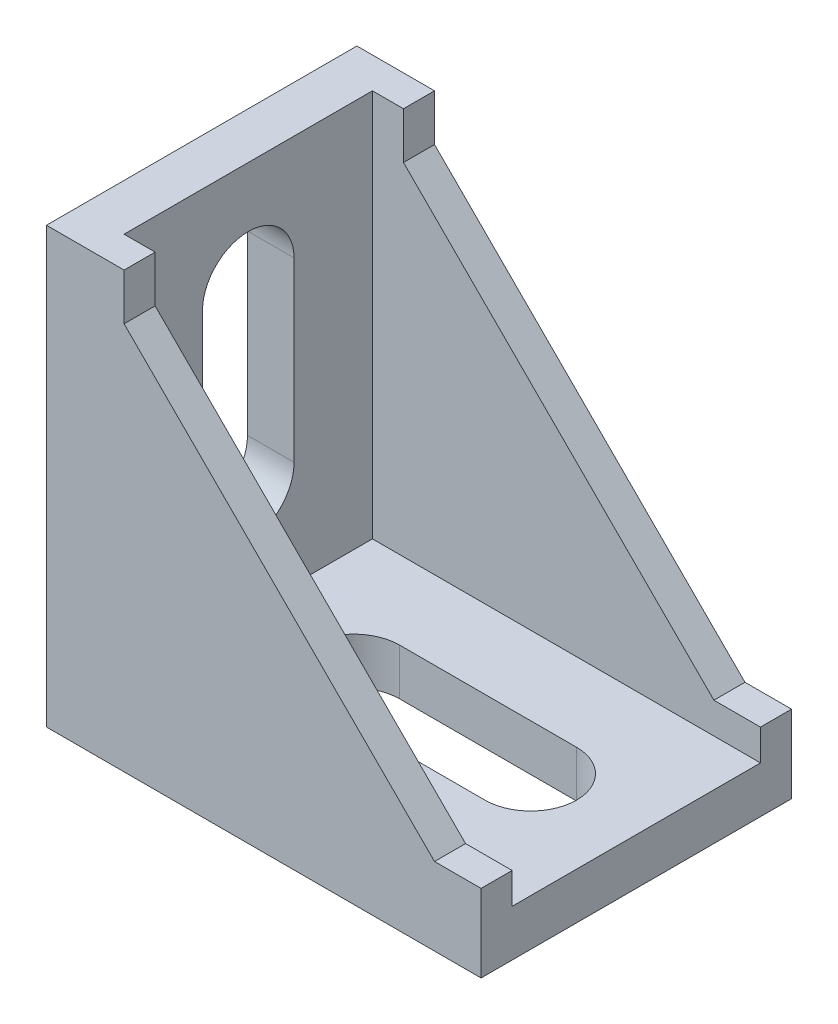
ISO-10303-21;
HEADER;
FILE_DESCRIPTION(('STEP AP214'),'2;1');
FILE_NAME('part.step','',(''),(''),'','','');
FILE_SCHEMA(('AUTOMOTIVE_DESIGN { 1 0 10303 214 1 1 1 1 }'));
ENDSEC;
DATA;
#1=APPLICATION_CONTEXT('core data for automotive mechanical design processes');
#2=APPLICATION_PROTOCOL_DEFINITION('international standard','automotive_design',2000,#1);
#3=PRODUCT_CONTEXT('',#1,'mechanical');
#4=PRODUCT('Part','Part','',(#3));
#5=PRODUCT_RELATED_PRODUCT_CATEGORY('part','',(#4));
#6=PRODUCT_DEFINITION_FORMATION('','',#4);
#7=PRODUCT_DEFINITION_CONTEXT('part definition',#1,'design');
#8=PRODUCT_DEFINITION('design','',#6,#7);
#9=PRODUCT_DEFINITION_SHAPE('','',#8);
#10=(LENGTH_UNIT() NAMED_UNIT(*) SI_UNIT(.MILLI.,.METRE.));
#11=(NAMED_UNIT(*) PLANE_ANGLE_UNIT() SI_UNIT($,.RADIAN.));
#12=(NAMED_UNIT(*) SI_UNIT($,.STERADIAN.) SOLID_ANGLE_UNIT());
#13=UNCERTAINTY_MEASURE_WITH_UNIT(LENGTH_MEASURE(1.E-05),#10,'distance_accuracy_value','');
#14=(GEOMETRIC_REPRESENTATION_CONTEXT(3) GLOBAL_UNCERTAINTY_ASSIGNED_CONTEXT((#13)) GLOBAL_UNIT_ASSIGNED_CONTEXT((#10,
#11,#12)) REPRESENTATION_CONTEXT('',''));
#15=CARTESIAN_POINT('',(0.,0.,0.));
#16=DIRECTION('',(0.,0.,1.));
#17=DIRECTION('',(1.,0.,0.));
#18=AXIS2_PLACEMENT_3D('',#15,#16,#17);
#19=CARTESIAN_POINT('',(3.,28.,-20.));
#20=DIRECTION('',(1.,0.,0.));
#21=DIRECTION('',(0.,1.,0.));
#22=AXIS2_PLACEMENT_3D('',#19,#20,#21);
#23=PLANE('',#22);
#24=CARTESIAN_POINT('',(3.,21.2,-10.));
#25=DIRECTION('',(1.,0.,0.));
#26=DIRECTION('',(0.,1.,0.));
#27=AXIS2_PLACEMENT_3D('',#24,#25,#26);
#28=CIRCLE('',#27,2.95);
#29=CARTESIAN_POINT('',(3.,21.2,-12.95));
#30=VERTEX_POINT('',#29);
#31=CARTESIAN_POINT('',(3.,21.2,-7.05));
#32=VERTEX_POINT('',#31);
#33=EDGE_CURVE('E265',#30,#32,#28,.T.);
#34=ORIENTED_EDGE('',*,*,#33,.F.);
#35=DIRECTION('',(0.,1.,0.));
#36=VECTOR('',#35,1.);
#37=CARTESIAN_POINT('',(3.,21.2,-12.95));
#38=LINE('',#37,#36);
#39=CARTESIAN_POINT('',(3.,9.8,-12.95));
#40=VERTEX_POINT('',#39);
#41=EDGE_CURVE('E279',#40,#30,#38,.T.);
#42=ORIENTED_EDGE('',*,*,#41,.F.);
#43=CARTESIAN_POINT('',(3.,9.8,-10.));
#44=DIRECTION('',(1.,0.,0.));
#45=DIRECTION('',(0.,1.,0.));
#46=AXIS2_PLACEMENT_3D('',#43,#44,#45);
#47=CIRCLE('',#46,2.95);
#48=CARTESIAN_POINT('',(3.,9.8,-7.05));
#49=VERTEX_POINT('',#48);
#50=EDGE_CURVE('E276',#49,#40,#47,.T.);
#51=ORIENTED_EDGE('',*,*,#50,.F.);
#52=DIRECTION('',(0.,-1.,0.));
#53=VECTOR('',#52,1.);
#54=CARTESIAN_POINT('',(3.,21.2,-7.05));
#55=LINE('',#54,#53);
#56=EDGE_CURVE('E273',#32,#49,#55,.T.);
#57=ORIENTED_EDGE('',*,*,#56,.F.);
#58=EDGE_LOOP('',(#34,#42,#51,#57));
#59=FACE_BOUND('',#58,.T.);
#60=DIRECTION('',(0.,0.,1.));
#61=VECTOR('',#60,1.);
#62=CARTESIAN_POINT('',(3.,3.,-20.));
#63=LINE('',#62,#61);
#64=CARTESIAN_POINT('',(3.,3.,-18.));
#65=VERTEX_POINT('',#64);
#66=CARTESIAN_POINT('',(3.,3.,-2.));
#67=VERTEX_POINT('',#66);
#68=EDGE_CURVE('E352',#65,#67,#63,.T.);
#69=ORIENTED_EDGE('',*,*,#68,.F.);
#70=DIRECTION('',(0.,-1.,0.));
#71=VECTOR('',#70,1.);
#72=CARTESIAN_POINT('',(3.,28.,-18.));
#73=LINE('',#72,#71);
#74=CARTESIAN_POINT('',(3.,28.,-18.));
#75=VERTEX_POINT('',#74);
#76=EDGE_CURVE('E61',#75,#65,#73,.T.);
#77=ORIENTED_EDGE('',*,*,#76,.F.);
#78=DIRECTION('',(0.,0.,1.));
#79=VECTOR('',#78,1.);
#80=CARTESIAN_POINT('',(3.,28.,-20.));
#81=LINE('',#80,#79);
#82=CARTESIAN_POINT('',(3.,28.,-2.));
#83=VERTEX_POINT('',#82);
#84=EDGE_CURVE('E210',#75,#83,#81,.T.);
#85=ORIENTED_EDGE('',*,*,#84,.T.);
#86=DIRECTION('',(0.,-1.,0.));
#87=VECTOR('',#86,1.);
#88=CARTESIAN_POINT('',(3.,28.,-2.));
#89=LINE('',#88,#87);
#90=EDGE_CURVE('E233',#83,#67,#89,.T.);
#91=ORIENTED_EDGE('',*,*,#90,.T.);
#92=EDGE_LOOP('',(#69,#77,#85,#91));
#93=FACE_BOUND('',#92,.T.);
#94=ADVANCED_FACE('F37',(#59,#93),#23,.T.);
#95=CARTESIAN_POINT('',(3.,3.,-20.));
#96=DIRECTION('',(0.,1.,0.));
#97=DIRECTION('',(-1.,0.,0.));
#98=AXIS2_PLACEMENT_3D('',#95,#96,#97);
#99=PLANE('',#98);
#100=CARTESIAN_POINT('',(9.8,3.,-10.));
#101=DIRECTION('',(0.,1.,0.));
#102=DIRECTION('',(-1.,0.,0.));
#103=AXIS2_PLACEMENT_3D('',#100,#101,#102);
#104=CIRCLE('',#103,2.95);
#105=CARTESIAN_POINT('',(9.8,3.,-12.95));
#106=VERTEX_POINT('',#105);
#107=CARTESIAN_POINT('',(9.8,3.,-7.05));
#108=VERTEX_POINT('',#107);
#109=EDGE_CURVE('E300',#106,#108,#104,.T.);
#110=ORIENTED_EDGE('',*,*,#109,.F.);
#111=DIRECTION('',(-1.,0.,0.));
#112=VECTOR('',#111,1.);
#113=CARTESIAN_POINT('',(9.8,3.,-12.95));
#114=LINE('',#113,#112);
#115=CARTESIAN_POINT('',(21.2,3.,-12.95));
#116=VERTEX_POINT('',#115);
#117=EDGE_CURVE('E308',#116,#106,#114,.T.);
#118=ORIENTED_EDGE('',*,*,#117,.F.);
#119=CARTESIAN_POINT('',(21.2,3.,-10.));
#120=DIRECTION('',(0.,1.,0.));
#121=DIRECTION('',(-1.,0.,0.));
#122=AXIS2_PLACEMENT_3D('',#119,#120,#121);
#123=CIRCLE('',#122,2.95);
#124=CARTESIAN_POINT('',(21.2,3.,-7.05));
#125=VERTEX_POINT('',#124);
#126=EDGE_CURVE('E305',#125,#116,#123,.T.);
#127=ORIENTED_EDGE('',*,*,#126,.F.);
#128=DIRECTION('',(1.,0.,0.));
#129=VECTOR('',#128,1.);
#130=CARTESIAN_POINT('',(9.8,3.,-7.05));
#131=LINE('',#130,#129);
#132=EDGE_CURVE('E302',#108,#125,#131,.T.);
#133=ORIENTED_EDGE('',*,*,#132,.F.);
#134=EDGE_LOOP('',(#110,#118,#127,#133));
#135=FACE_BOUND('',#134,.T.);
#136=DIRECTION('',(0.,0.,1.));
#137=VECTOR('',#136,1.);
#138=CARTESIAN_POINT('',(28.,3.,-20.));
#139=LINE('',#138,#137);
#140=CARTESIAN_POINT('',(28.,3.,-18.));
#141=VERTEX_POINT('',#140);
#142=CARTESIAN_POINT('',(28.,3.,-2.));
#143=VERTEX_POINT('',#142);
#144=EDGE_CURVE('E353',#141,#143,#139,.T.);
#145=ORIENTED_EDGE('',*,*,#144,.F.);
#146=DIRECTION('',(1.,0.,0.));
#147=VECTOR('',#146,1.);
#148=CARTESIAN_POINT('',(3.,3.,-18.));
#149=LINE('',#148,#147);
#150=EDGE_CURVE('E54',#65,#141,#149,.T.);
#151=ORIENTED_EDGE('',*,*,#150,.F.);
#152=ORIENTED_EDGE('',*,*,#68,.T.);
#153=DIRECTION('',(1.,0.,0.));
#154=VECTOR('',#153,1.);
#155=CARTESIAN_POINT('',(3.,3.,-2.));
#156=LINE('',#155,#154);
#157=EDGE_CURVE('E236',#67,#143,#156,.T.);
#158=ORIENTED_EDGE('',*,*,#157,.T.);
#159=EDGE_LOOP('',(#145,#151,#152,#158));
#160=FACE_BOUND('',#159,.T.);
#161=ADVANCED_FACE('F395',(#135,#160),#99,.T.);
#162=CARTESIAN_POINT('',(28.,0.,-20.));
#163=DIRECTION('',(0.,-1.,0.));
#164=DIRECTION('',(1.,0.,0.));
#165=AXIS2_PLACEMENT_3D('',#162,#163,#164);
#166=PLANE('',#165);
#167=CARTESIAN_POINT('',(9.8,0.,-10.));
#168=DIRECTION('',(0.,-1.,0.));
#169=DIRECTION('',(1.,0.,0.));
#170=AXIS2_PLACEMENT_3D('',#167,#168,#169);
#171=CIRCLE('',#170,2.95);
#172=CARTESIAN_POINT('',(9.8,0.,-7.05));
#173=VERTEX_POINT('',#172);
#174=CARTESIAN_POINT('',(9.8,0.,-12.95));
#175=VERTEX_POINT('',#174);
#176=EDGE_CURVE('E327',#173,#175,#171,.T.);
#177=ORIENTED_EDGE('',*,*,#176,.F.);
#178=DIRECTION('',(-1.,0.,0.));
#179=VECTOR('',#178,1.);
#180=CARTESIAN_POINT('',(28.,0.,-7.05000000000001));
#181=LINE('',#180,#179);
#182=CARTESIAN_POINT('',(21.2,0.,-7.05000000000001));
#183=VERTEX_POINT('',#182);
#184=EDGE_CURVE('E314',#183,#173,#181,.T.);
#185=ORIENTED_EDGE('',*,*,#184,.F.);
#186=CARTESIAN_POINT('',(21.2,0.,-10.));
#187=DIRECTION('',(0.,-1.,0.));
#188=DIRECTION('',(1.,0.,0.));
#189=AXIS2_PLACEMENT_3D('',#186,#187,#188);
#190=CIRCLE('',#189,2.95);
#191=CARTESIAN_POINT('',(21.2,0.,-12.95));
#192=VERTEX_POINT('',#191);
#193=EDGE_CURVE('E322',#192,#183,#190,.T.);
#194=ORIENTED_EDGE('',*,*,#193,.F.);
#195=DIRECTION('',(1.,0.,0.));
#196=VECTOR('',#195,1.);
#197=CARTESIAN_POINT('',(28.,0.,-12.95));
#198=LINE('',#197,#196);
#199=EDGE_CURVE('E325',#175,#192,#198,.T.);
#200=ORIENTED_EDGE('',*,*,#199,.F.);
#201=EDGE_LOOP('',(#177,#185,#194,#200));
#202=FACE_BOUND('',#201,.T.);
#203=DIRECTION('',(1.,0.,0.));
#204=VECTOR('',#203,1.);
#205=CARTESIAN_POINT('',(28.,0.,0.));
#206=LINE('',#205,#204);
#207=CARTESIAN_POINT('',(0.,0.,0.));
#208=VERTEX_POINT('',#207);
#209=CARTESIAN_POINT('',(28.,0.,0.));
#210=VERTEX_POINT('',#209);
#211=EDGE_CURVE('E329',#208,#210,#206,.T.);
#212=ORIENTED_EDGE('',*,*,#211,.F.);
#213=DIRECTION('',(0.,0.,1.));
#214=VECTOR('',#213,1.);
#215=CARTESIAN_POINT('',(0.,0.,-20.));
#216=LINE('',#215,#214);
#217=CARTESIAN_POINT('',(0.,0.,-20.));
#218=VERTEX_POINT('',#217);
#219=EDGE_CURVE('E11',#218,#208,#216,.T.);
#220=ORIENTED_EDGE('',*,*,#219,.F.);
#221=DIRECTION('',(1.,0.,0.));
#222=VECTOR('',#221,1.);
#223=CARTESIAN_POINT('',(28.,0.,-20.));
#224=LINE('',#223,#222);
#225=CARTESIAN_POINT('',(28.,0.,-20.));
#226=VERTEX_POINT('',#225);
#227=EDGE_CURVE('E330',#218,#226,#224,.T.);
#228=ORIENTED_EDGE('',*,*,#227,.T.);
#229=DIRECTION('',(0.,0.,1.));
#230=VECTOR('',#229,1.);
#231=CARTESIAN_POINT('',(28.,0.,-20.));
#232=LINE('',#231,#230);
#233=EDGE_CURVE('E41',#226,#210,#232,.T.);
#234=ORIENTED_EDGE('',*,*,#233,.T.);
#235=EDGE_LOOP('',(#212,#220,#228,#234));
#236=FACE_BOUND('',#235,.T.);
#237=ADVANCED_FACE('F39',(#202,#236),#166,.T.);
#238=CARTESIAN_POINT('',(0.,0.,-20.));
#239=DIRECTION('',(-1.,0.,0.));
#240=DIRECTION('',(0.,0.,1.));
#241=AXIS2_PLACEMENT_3D('',#238,#239,#240);
#242=PLANE('',#241);
#243=CARTESIAN_POINT('',(0.,21.2,-10.));
#244=DIRECTION('',(-1.,0.,0.));
#245=DIRECTION('',(0.,0.,1.));
#246=AXIS2_PLACEMENT_3D('',#243,#244,#245);
#247=CIRCLE('',#246,2.95);
#248=CARTESIAN_POINT('',(0.,21.2,-7.05));
#249=VERTEX_POINT('',#248);
#250=CARTESIAN_POINT('',(0.,21.2,-12.95));
#251=VERTEX_POINT('',#250);
#252=EDGE_CURVE('E298',#249,#251,#247,.T.);
#253=ORIENTED_EDGE('',*,*,#252,.F.);
#254=DIRECTION('',(0.,1.,0.));
#255=VECTOR('',#254,1.);
#256=CARTESIAN_POINT('',(0.,0.,-7.05));
#257=LINE('',#256,#255);
#258=CARTESIAN_POINT('',(0.,9.8,-7.05));
#259=VERTEX_POINT('',#258);
#260=EDGE_CURVE('E285',#259,#249,#257,.T.);
#261=ORIENTED_EDGE('',*,*,#260,.F.);
#262=CARTESIAN_POINT('',(0.,9.8,-10.));
#263=DIRECTION('',(-1.,0.,0.));
#264=DIRECTION('',(0.,0.,1.));
#265=AXIS2_PLACEMENT_3D('',#262,#263,#264);
#266=CIRCLE('',#265,2.95);
#267=CARTESIAN_POINT('',(0.,9.8,-12.95));
#268=VERTEX_POINT('',#267);
#269=EDGE_CURVE('E293',#268,#259,#266,.T.);
#270=ORIENTED_EDGE('',*,*,#269,.F.);
#271=DIRECTION('',(0.,-1.,0.));
#272=VECTOR('',#271,1.);
#273=CARTESIAN_POINT('',(0.,0.,-12.95));
#274=LINE('',#273,#272);
#275=EDGE_CURVE('E296',#251,#268,#274,.T.);
#276=ORIENTED_EDGE('',*,*,#275,.F.);
#277=EDGE_LOOP('',(#253,#261,#270,#276));
#278=FACE_BOUND('',#277,.T.);
#279=DIRECTION('',(0.,-1.,0.));
#280=VECTOR('',#279,1.);
#281=CARTESIAN_POINT('',(0.,0.,0.));
#282=LINE('',#281,#280);
#283=CARTESIAN_POINT('',(0.,28.,0.));
#284=VERTEX_POINT('',#283);
#285=EDGE_CURVE('E334',#284,#208,#282,.T.);
#286=ORIENTED_EDGE('',*,*,#285,.F.);
#287=DIRECTION('',(0.,0.,1.));
#288=VECTOR('',#287,1.);
#289=CARTESIAN_POINT('',(0.,28.,-20.));
#290=LINE('',#289,#288);
#291=CARTESIAN_POINT('',(0.,28.,-20.));
#292=VERTEX_POINT('',#291);
#293=EDGE_CURVE('E46',#292,#284,#290,.T.);
#294=ORIENTED_EDGE('',*,*,#293,.F.);
#295=DIRECTION('',(0.,-1.,0.));
#296=VECTOR('',#295,1.);
#297=CARTESIAN_POINT('',(0.,0.,-20.));
#298=LINE('',#297,#296);
#299=EDGE_CURVE('E338',#292,#218,#298,.T.);
#300=ORIENTED_EDGE('',*,*,#299,.T.);
#301=ORIENTED_EDGE('',*,*,#219,.T.);
#302=EDGE_LOOP('',(#286,#294,#300,#301));
#303=FACE_BOUND('',#302,.T.);
#304=ADVANCED_FACE('F368',(#278,#303),#242,.T.);
#305=CARTESIAN_POINT('',(0.,28.,-20.));
#306=DIRECTION('',(0.,1.,0.));
#307=DIRECTION('',(0.,0.,1.));
#308=AXIS2_PLACEMENT_3D('',#305,#306,#307);
#309=PLANE('',#308);
#310=DIRECTION('',(-1.,0.,0.));
#311=VECTOR('',#310,1.);
#312=CARTESIAN_POINT('',(0.,28.,0.));
#313=LINE('',#312,#311);
#314=CARTESIAN_POINT('',(5.,28.,0.));
#315=VERTEX_POINT('',#314);
#316=EDGE_CURVE('E345',#315,#284,#313,.T.);
#317=ORIENTED_EDGE('',*,*,#316,.F.);
#318=DIRECTION('',(0.,0.,1.));
#319=VECTOR('',#318,1.);
#320=CARTESIAN_POINT('',(5.,28.,-2.));
#321=LINE('',#320,#319);
#322=CARTESIAN_POINT('',(5.,28.,-2.));
#323=VERTEX_POINT('',#322);
#324=EDGE_CURVE('E262',#323,#315,#321,.T.);
#325=ORIENTED_EDGE('',*,*,#324,.F.);
#326=DIRECTION('',(-1.,0.,0.));
#327=VECTOR('',#326,1.);
#328=CARTESIAN_POINT('',(3.,28.,-2.));
#329=LINE('',#328,#327);
#330=EDGE_CURVE('E252',#323,#83,#329,.T.);
#331=ORIENTED_EDGE('',*,*,#330,.T.);
#332=ORIENTED_EDGE('',*,*,#84,.F.);
#333=DIRECTION('',(-1.,0.,0.));
#334=VECTOR('',#333,1.);
#335=CARTESIAN_POINT('',(3.,28.,-18.));
#336=LINE('',#335,#334);
#337=CARTESIAN_POINT('',(5.,28.,-18.));
#338=VERTEX_POINT('',#337);
#339=EDGE_CURVE('E191',#338,#75,#336,.T.);
#340=ORIENTED_EDGE('',*,*,#339,.F.);
#341=DIRECTION('',(0.,0.,-1.));
#342=VECTOR('',#341,1.);
#343=CARTESIAN_POINT('',(5.,28.,-18.));
#344=LINE('',#343,#342);
#345=CARTESIAN_POINT('',(5.,28.,-20.));
#346=VERTEX_POINT('',#345);
#347=EDGE_CURVE('E200',#338,#346,#344,.T.);
#348=ORIENTED_EDGE('',*,*,#347,.T.);
#349=DIRECTION('',(-1.,0.,0.));
#350=VECTOR('',#349,1.);
#351=CARTESIAN_POINT('',(0.,28.,-20.));
#352=LINE('',#351,#350);
#353=EDGE_CURVE('E336',#346,#292,#352,.T.);
#354=ORIENTED_EDGE('',*,*,#353,.T.);
#355=ORIENTED_EDGE('',*,*,#293,.T.);
#356=EDGE_LOOP('',(#317,#325,#331,#332,#340,#348,#354,#355));
#357=FACE_BOUND('',#356,.T.);
#358=ADVANCED_FACE('F208',(#357),#309,.T.);
#359=CARTESIAN_POINT('',(28.,3.,-20.));
#360=DIRECTION('',(1.,0.,0.));
#361=DIRECTION('',(0.,0.,-1.));
#362=AXIS2_PLACEMENT_3D('',#359,#360,#361);
#363=PLANE('',#362);
#364=DIRECTION('',(0.,1.,0.));
#365=VECTOR('',#364,1.);
#366=CARTESIAN_POINT('',(28.,3.,0.));
#367=LINE('',#366,#365);
#368=CARTESIAN_POINT('',(28.,5.,0.));
#369=VERTEX_POINT('',#368);
#370=EDGE_CURVE('E343',#210,#369,#367,.T.);
#371=ORIENTED_EDGE('',*,*,#370,.F.);
#372=ORIENTED_EDGE('',*,*,#233,.F.);
#373=DIRECTION('',(0.,1.,0.));
#374=VECTOR('',#373,1.);
#375=CARTESIAN_POINT('',(28.,3.,-20.));
#376=LINE('',#375,#374);
#377=CARTESIAN_POINT('',(28.,5.,-20.));
#378=VERTEX_POINT('',#377);
#379=EDGE_CURVE('E333',#226,#378,#376,.T.);
#380=ORIENTED_EDGE('',*,*,#379,.T.);
#381=DIRECTION('',(0.,0.,-1.));
#382=VECTOR('',#381,1.);
#383=CARTESIAN_POINT('',(28.,5.,-18.));
#384=LINE('',#383,#382);
#385=CARTESIAN_POINT('',(28.,5.,-18.));
#386=VERTEX_POINT('',#385);
#387=EDGE_CURVE('E225',#386,#378,#384,.T.);
#388=ORIENTED_EDGE('',*,*,#387,.F.);
#389=DIRECTION('',(0.,1.,0.));
#390=VECTOR('',#389,1.);
#391=CARTESIAN_POINT('',(28.,5.,-18.));
#392=LINE('',#391,#390);
#393=EDGE_CURVE('E218',#141,#386,#392,.T.);
#394=ORIENTED_EDGE('',*,*,#393,.F.);
#395=ORIENTED_EDGE('',*,*,#144,.T.);
#396=DIRECTION('',(0.,1.,0.));
#397=VECTOR('',#396,1.);
#398=CARTESIAN_POINT('',(28.,5.,-2.));
#399=LINE('',#398,#397);
#400=CARTESIAN_POINT('',(28.,5.,-2.));
#401=VERTEX_POINT('',#400);
#402=EDGE_CURVE('E240',#143,#401,#399,.T.);
#403=ORIENTED_EDGE('',*,*,#402,.T.);
#404=DIRECTION('',(0.,0.,1.));
#405=VECTOR('',#404,1.);
#406=CARTESIAN_POINT('',(28.,5.,-2.));
#407=LINE('',#406,#405);
#408=EDGE_CURVE('E254',#401,#369,#407,.T.);
#409=ORIENTED_EDGE('',*,*,#408,.T.);
#410=EDGE_LOOP('',(#371,#372,#380,#388,#394,#395,#403,#409));
#411=FACE_BOUND('',#410,.T.);
#412=ADVANCED_FACE('F362',(#411),#363,.T.);
#413=CARTESIAN_POINT('',(0.,0.,-20.));
#414=DIRECTION('',(0.,0.,-1.));
#415=DIRECTION('',(-1.,0.,0.));
#416=AXIS2_PLACEMENT_3D('',#413,#414,#415);
#417=PLANE('',#416);
#418=ORIENTED_EDGE('',*,*,#353,.F.);
#419=DIRECTION('',(0.,1.,0.));
#420=VECTOR('',#419,1.);
#421=CARTESIAN_POINT('',(5.,28.,-20.));
#422=LINE('',#421,#420);
#423=CARTESIAN_POINT('',(5.,24.9999999999999,-20.));
#424=VERTEX_POINT('',#423);
#425=EDGE_CURVE('E203',#424,#346,#422,.T.);
#426=ORIENTED_EDGE('',*,*,#425,.F.);
#427=DIRECTION('',(-0.707106781186549,0.707106781186546,0.));
#428=VECTOR('',#427,1.);
#429=CARTESIAN_POINT('',(5.,24.9999999999999,-20.));
#430=LINE('',#429,#428);
#431=CARTESIAN_POINT('',(25.,5.,-20.));
#432=VERTEX_POINT('',#431);
#433=EDGE_CURVE('E222',#432,#424,#430,.T.);
#434=ORIENTED_EDGE('',*,*,#433,.F.);
#435=DIRECTION('',(-1.,0.,0.));
#436=VECTOR('',#435,1.);
#437=CARTESIAN_POINT('',(25.,5.,-20.));
#438=LINE('',#437,#436);
#439=EDGE_CURVE('E212',#378,#432,#438,.T.);
#440=ORIENTED_EDGE('',*,*,#439,.F.);
#441=ORIENTED_EDGE('',*,*,#379,.F.);
#442=ORIENTED_EDGE('',*,*,#227,.F.);
#443=ORIENTED_EDGE('',*,*,#299,.F.);
#444=EDGE_LOOP('',(#418,#426,#434,#440,#441,#442,#443));
#445=FACE_BOUND('',#444,.T.);
#446=ADVANCED_FACE('F371',(#445),#417,.T.);
#447=CARTESIAN_POINT('',(0.,0.,0.));
#448=DIRECTION('',(0.,0.,-1.));
#449=DIRECTION('',(-1.,0.,0.));
#450=AXIS2_PLACEMENT_3D('',#447,#448,#449);
#451=PLANE('',#450);
#452=DIRECTION('',(0.,1.,0.));
#453=VECTOR('',#452,1.);
#454=CARTESIAN_POINT('',(5.,28.,0.));
#455=LINE('',#454,#453);
#456=CARTESIAN_POINT('',(5.,24.9999999999999,0.));
#457=VERTEX_POINT('',#456);
#458=EDGE_CURVE('E237',#457,#315,#455,.T.);
#459=ORIENTED_EDGE('',*,*,#458,.T.);
#460=ORIENTED_EDGE('',*,*,#316,.T.);
#461=ORIENTED_EDGE('',*,*,#285,.T.);
#462=ORIENTED_EDGE('',*,*,#211,.T.);
#463=ORIENTED_EDGE('',*,*,#370,.T.);
#464=DIRECTION('',(-1.,0.,0.));
#465=VECTOR('',#464,1.);
#466=CARTESIAN_POINT('',(25.,5.,0.));
#467=LINE('',#466,#465);
#468=CARTESIAN_POINT('',(25.,5.,0.));
#469=VERTEX_POINT('',#468);
#470=EDGE_CURVE('E228',#369,#469,#467,.T.);
#471=ORIENTED_EDGE('',*,*,#470,.T.);
#472=DIRECTION('',(-0.707106781186549,0.707106781186546,0.));
#473=VECTOR('',#472,1.);
#474=CARTESIAN_POINT('',(5.,24.9999999999999,0.));
#475=LINE('',#474,#473);
#476=EDGE_CURVE('E257',#469,#457,#475,.T.);
#477=ORIENTED_EDGE('',*,*,#476,.T.);
#478=EDGE_LOOP('',(#459,#460,#461,#462,#463,#471,#477));
#479=FACE_BOUND('',#478,.T.);
#480=ADVANCED_FACE('F365',(#479),#451,.F.);
#481=CARTESIAN_POINT('',(9.8,-7.,-10.));
#482=DIRECTION('',(0.,1.,0.));
#483=DIRECTION('',(-1.,0.,0.));
#484=AXIS2_PLACEMENT_3D('',#481,#482,#483);
#485=CYLINDRICAL_SURFACE('',#484,2.95);
#486=ORIENTED_EDGE('',*,*,#176,.T.);
#487=DIRECTION('',(0.,1.,0.));
#488=VECTOR('',#487,1.);
#489=CARTESIAN_POINT('',(9.8,-7.,-12.95));
#490=LINE('',#489,#488);
#491=EDGE_CURVE('E312',#175,#106,#490,.T.);
#492=ORIENTED_EDGE('',*,*,#491,.T.);
#493=ORIENTED_EDGE('',*,*,#109,.T.);
#494=DIRECTION('',(0.,1.,0.));
#495=VECTOR('',#494,1.);
#496=CARTESIAN_POINT('',(9.8,-7.,-7.05));
#497=LINE('',#496,#495);
#498=EDGE_CURVE('E311',#173,#108,#497,.T.);
#499=ORIENTED_EDGE('',*,*,#498,.F.);
#500=EDGE_LOOP('',(#486,#492,#493,#499));
#501=FACE_BOUND('',#500,.T.);
#502=ADVANCED_FACE('F421',(#501),#485,.F.);
#503=CARTESIAN_POINT('',(9.8,-7.,-12.95));
#504=DIRECTION('',(0.,0.,-1.));
#505=DIRECTION('',(-1.,0.,0.));
#506=AXIS2_PLACEMENT_3D('',#503,#504,#505);
#507=PLANE('',#506);
#508=ORIENTED_EDGE('',*,*,#199,.T.);
#509=DIRECTION('',(0.,1.,0.));
#510=VECTOR('',#509,1.);
#511=CARTESIAN_POINT('',(21.2,-7.,-12.95));
#512=LINE('',#511,#510);
#513=EDGE_CURVE('E315',#192,#116,#512,.T.);
#514=ORIENTED_EDGE('',*,*,#513,.T.);
#515=ORIENTED_EDGE('',*,*,#117,.T.);
#516=ORIENTED_EDGE('',*,*,#491,.F.);
#517=EDGE_LOOP('',(#508,#514,#515,#516));
#518=FACE_BOUND('',#517,.T.);
#519=ADVANCED_FACE('F425',(#518),#507,.F.);
#520=CARTESIAN_POINT('',(21.2,-7.,-10.));
#521=DIRECTION('',(0.,1.,0.));
#522=DIRECTION('',(-1.,0.,0.));
#523=AXIS2_PLACEMENT_3D('',#520,#521,#522);
#524=CYLINDRICAL_SURFACE('',#523,2.95);
#525=ORIENTED_EDGE('',*,*,#193,.T.);
#526=DIRECTION('',(0.,1.,0.));
#527=VECTOR('',#526,1.);
#528=CARTESIAN_POINT('',(21.2,-7.,-7.05));
#529=LINE('',#528,#527);
#530=EDGE_CURVE('E317',#183,#125,#529,.T.);
#531=ORIENTED_EDGE('',*,*,#530,.T.);
#532=ORIENTED_EDGE('',*,*,#126,.T.);
#533=ORIENTED_EDGE('',*,*,#513,.F.);
#534=EDGE_LOOP('',(#525,#531,#532,#533));
#535=FACE_BOUND('',#534,.T.);
#536=ADVANCED_FACE('F431',(#535),#524,.F.);
#537=CARTESIAN_POINT('',(9.8,-7.,-7.05));
#538=DIRECTION('',(0.,0.,1.));
#539=DIRECTION('',(1.,0.,0.));
#540=AXIS2_PLACEMENT_3D('',#537,#538,#539);
#541=PLANE('',#540);
#542=ORIENTED_EDGE('',*,*,#184,.T.);
#543=ORIENTED_EDGE('',*,*,#498,.T.);
#544=ORIENTED_EDGE('',*,*,#132,.T.);
#545=ORIENTED_EDGE('',*,*,#530,.F.);
#546=EDGE_LOOP('',(#542,#543,#544,#545));
#547=FACE_BOUND('',#546,.T.);
#548=ADVANCED_FACE('F427',(#547),#541,.F.);
#549=CARTESIAN_POINT('',(-7.,21.2,-10.));
#550=DIRECTION('',(1.,0.,0.));
#551=DIRECTION('',(0.,1.,0.));
#552=AXIS2_PLACEMENT_3D('',#549,#550,#551);
#553=CYLINDRICAL_SURFACE('',#552,2.95);
#554=ORIENTED_EDGE('',*,*,#252,.T.);
#555=DIRECTION('',(1.,0.,0.));
#556=VECTOR('',#555,1.);
#557=CARTESIAN_POINT('',(-7.,21.2,-12.95));
#558=LINE('',#557,#556);
#559=EDGE_CURVE('E283',#251,#30,#558,.T.);
#560=ORIENTED_EDGE('',*,*,#559,.T.);
#561=ORIENTED_EDGE('',*,*,#33,.T.);
#562=DIRECTION('',(1.,0.,0.));
#563=VECTOR('',#562,1.);
#564=CARTESIAN_POINT('',(-7.,21.2,-7.05));
#565=LINE('',#564,#563);
#566=EDGE_CURVE('E282',#249,#32,#565,.T.);
#567=ORIENTED_EDGE('',*,*,#566,.F.);
#568=EDGE_LOOP('',(#554,#560,#561,#567));
#569=FACE_BOUND('',#568,.T.);
#570=ADVANCED_FACE('F430',(#569),#553,.F.);
#571=CARTESIAN_POINT('',(-7.,21.2,-12.95));
#572=DIRECTION('',(0.,0.,-1.));
#573=DIRECTION('',(-1.,0.,0.));
#574=AXIS2_PLACEMENT_3D('',#571,#572,#573);
#575=PLANE('',#574);
#576=ORIENTED_EDGE('',*,*,#275,.T.);
#577=DIRECTION('',(1.,0.,0.));
#578=VECTOR('',#577,1.);
#579=CARTESIAN_POINT('',(-7.,9.8,-12.95));
#580=LINE('',#579,#578);
#581=EDGE_CURVE('E286',#268,#40,#580,.T.);
#582=ORIENTED_EDGE('',*,*,#581,.T.);
#583=ORIENTED_EDGE('',*,*,#41,.T.);
#584=ORIENTED_EDGE('',*,*,#559,.F.);
#585=EDGE_LOOP('',(#576,#582,#583,#584));
#586=FACE_BOUND('',#585,.T.);
#587=ADVANCED_FACE('F441',(#586),#575,.F.);
#588=CARTESIAN_POINT('',(-7.,9.8,-10.));
#589=DIRECTION('',(1.,0.,0.));
#590=DIRECTION('',(0.,1.,0.));
#591=AXIS2_PLACEMENT_3D('',#588,#589,#590);
#592=CYLINDRICAL_SURFACE('',#591,2.95);
#593=ORIENTED_EDGE('',*,*,#269,.T.);
#594=DIRECTION('',(1.,0.,0.));
#595=VECTOR('',#594,1.);
#596=CARTESIAN_POINT('',(-7.,9.8,-7.05));
#597=LINE('',#596,#595);
#598=EDGE_CURVE('E288',#259,#49,#597,.T.);
#599=ORIENTED_EDGE('',*,*,#598,.T.);
#600=ORIENTED_EDGE('',*,*,#50,.T.);
#601=ORIENTED_EDGE('',*,*,#581,.F.);
#602=EDGE_LOOP('',(#593,#599,#600,#601));
#603=FACE_BOUND('',#602,.T.);
#604=ADVANCED_FACE('F446',(#603),#592,.F.);
#605=CARTESIAN_POINT('',(-7.,21.2,-7.05));
#606=DIRECTION('',(0.,0.,1.));
#607=DIRECTION('',(1.,0.,0.));
#608=AXIS2_PLACEMENT_3D('',#605,#606,#607);
#609=PLANE('',#608);
#610=ORIENTED_EDGE('',*,*,#260,.T.);
#611=ORIENTED_EDGE('',*,*,#566,.T.);
#612=ORIENTED_EDGE('',*,*,#56,.T.);
#613=ORIENTED_EDGE('',*,*,#598,.F.);
#614=EDGE_LOOP('',(#610,#611,#612,#613));
#615=FACE_BOUND('',#614,.T.);
#616=ADVANCED_FACE('F443',(#615),#609,.F.);
#617=CARTESIAN_POINT('',(5.,28.,-2.));
#618=DIRECTION('',(1.,0.,0.));
#619=DIRECTION('',(0.,0.,-1.));
#620=AXIS2_PLACEMENT_3D('',#617,#618,#619);
#621=PLANE('',#620);
#622=ORIENTED_EDGE('',*,*,#458,.F.);
#623=DIRECTION('',(0.,0.,1.));
#624=VECTOR('',#623,1.);
#625=CARTESIAN_POINT('',(5.,24.9999999999999,-2.));
#626=LINE('',#625,#624);
#627=CARTESIAN_POINT('',(5.,24.9999999999999,-2.));
#628=VERTEX_POINT('',#627);
#629=EDGE_CURVE('E266',#628,#457,#626,.T.);
#630=ORIENTED_EDGE('',*,*,#629,.F.);
#631=DIRECTION('',(0.,1.,0.));
#632=VECTOR('',#631,1.);
#633=CARTESIAN_POINT('',(5.,28.,-2.));
#634=LINE('',#633,#632);
#635=EDGE_CURVE('E249',#628,#323,#634,.T.);
#636=ORIENTED_EDGE('',*,*,#635,.T.);
#637=ORIENTED_EDGE('',*,*,#324,.T.);
#638=EDGE_LOOP('',(#622,#630,#636,#637));
#639=FACE_BOUND('',#638,.T.);
#640=ADVANCED_FACE('F383',(#639),#621,.T.);
#641=CARTESIAN_POINT('',(5.,24.9999999999999,-2.));
#642=DIRECTION('',(0.707106781186546,0.707106781186549,0.));
#643=DIRECTION('',(-0.707106781186549,0.707106781186546,0.));
#644=AXIS2_PLACEMENT_3D('',#641,#642,#643);
#645=PLANE('',#644);
#646=ORIENTED_EDGE('',*,*,#476,.F.);
#647=DIRECTION('',(0.,0.,1.));
#648=VECTOR('',#647,1.);
#649=CARTESIAN_POINT('',(25.,5.,-2.));
#650=LINE('',#649,#648);
#651=CARTESIAN_POINT('',(25.,5.,-2.));
#652=VERTEX_POINT('',#651);
#653=EDGE_CURVE('E268',#652,#469,#650,.T.);
#654=ORIENTED_EDGE('',*,*,#653,.F.);
#655=DIRECTION('',(-0.707106781186549,0.707106781186546,0.));
#656=VECTOR('',#655,1.);
#657=CARTESIAN_POINT('',(5.,24.9999999999999,-2.));
#658=LINE('',#657,#656);
#659=EDGE_CURVE('E246',#652,#628,#658,.T.);
#660=ORIENTED_EDGE('',*,*,#659,.T.);
#661=ORIENTED_EDGE('',*,*,#629,.T.);
#662=EDGE_LOOP('',(#646,#654,#660,#661));
#663=FACE_BOUND('',#662,.T.);
#664=ADVANCED_FACE('F388',(#663),#645,.T.);
#665=CARTESIAN_POINT('',(25.,5.,-2.));
#666=DIRECTION('',(0.,1.,0.));
#667=DIRECTION('',(0.,0.,1.));
#668=AXIS2_PLACEMENT_3D('',#665,#666,#667);
#669=PLANE('',#668);
#670=ORIENTED_EDGE('',*,*,#470,.F.);
#671=ORIENTED_EDGE('',*,*,#408,.F.);
#672=DIRECTION('',(-1.,0.,0.));
#673=VECTOR('',#672,1.);
#674=CARTESIAN_POINT('',(25.,5.,-2.));
#675=LINE('',#674,#673);
#676=EDGE_CURVE('E243',#401,#652,#675,.T.);
#677=ORIENTED_EDGE('',*,*,#676,.T.);
#678=ORIENTED_EDGE('',*,*,#653,.T.);
#679=EDGE_LOOP('',(#670,#671,#677,#678));
#680=FACE_BOUND('',#679,.T.);
#681=ADVANCED_FACE('F454',(#680),#669,.T.);
#682=CARTESIAN_POINT('',(0.,0.,-2.));
#683=DIRECTION('',(0.,0.,1.));
#684=DIRECTION('',(1.,0.,0.));
#685=AXIS2_PLACEMENT_3D('',#682,#683,#684);
#686=PLANE('',#685);
#687=ORIENTED_EDGE('',*,*,#90,.F.);
#688=ORIENTED_EDGE('',*,*,#330,.F.);
#689=ORIENTED_EDGE('',*,*,#635,.F.);
#690=ORIENTED_EDGE('',*,*,#659,.F.);
#691=ORIENTED_EDGE('',*,*,#676,.F.);
#692=ORIENTED_EDGE('',*,*,#402,.F.);
#693=ORIENTED_EDGE('',*,*,#157,.F.);
#694=EDGE_LOOP('',(#687,#688,#689,#690,#691,#692,#693));
#695=FACE_BOUND('',#694,.T.);
#696=ADVANCED_FACE('F392',(#695),#686,.F.);
#697=CARTESIAN_POINT('',(25.,5.,-18.));
#698=DIRECTION('',(0.,-1.,0.));
#699=DIRECTION('',(0.,0.,-1.));
#700=AXIS2_PLACEMENT_3D('',#697,#698,#699);
#701=PLANE('',#700);
#702=ORIENTED_EDGE('',*,*,#439,.T.);
#703=DIRECTION('',(0.,0.,-1.));
#704=VECTOR('',#703,1.);
#705=CARTESIAN_POINT('',(25.,5.,-18.));
#706=LINE('',#705,#704);
#707=CARTESIAN_POINT('',(25.,5.,-18.));
#708=VERTEX_POINT('',#707);
#709=EDGE_CURVE('E229',#708,#432,#706,.T.);
#710=ORIENTED_EDGE('',*,*,#709,.F.);
#711=DIRECTION('',(-1.,0.,0.));
#712=VECTOR('',#711,1.);
#713=CARTESIAN_POINT('',(25.,5.,-18.));
#714=LINE('',#713,#712);
#715=EDGE_CURVE('E216',#386,#708,#714,.T.);
#716=ORIENTED_EDGE('',*,*,#715,.F.);
#717=ORIENTED_EDGE('',*,*,#387,.T.);
#718=EDGE_LOOP('',(#702,#710,#716,#717));
#719=FACE_BOUND('',#718,.T.);
#720=ADVANCED_FACE('F377',(#719),#701,.F.);
#721=CARTESIAN_POINT('',(5.,24.9999999999999,-18.));
#722=DIRECTION('',(-0.707106781186546,-0.707106781186549,0.));
#723=DIRECTION('',(0.707106781186549,-0.707106781186546,0.));
#724=AXIS2_PLACEMENT_3D('',#721,#722,#723);
#725=PLANE('',#724);
#726=ORIENTED_EDGE('',*,*,#433,.T.);
#727=DIRECTION('',(0.,0.,-1.));
#728=VECTOR('',#727,1.);
#729=CARTESIAN_POINT('',(5.,24.9999999999999,-18.));
#730=LINE('',#729,#728);
#731=CARTESIAN_POINT('',(5.,24.9999999999999,-18.));
#732=VERTEX_POINT('',#731);
#733=EDGE_CURVE('E206',#732,#424,#730,.T.);
#734=ORIENTED_EDGE('',*,*,#733,.F.);
#735=DIRECTION('',(-0.707106781186549,0.707106781186546,0.));
#736=VECTOR('',#735,1.);
#737=CARTESIAN_POINT('',(5.,24.9999999999999,-18.));
#738=LINE('',#737,#736);
#739=EDGE_CURVE('E193',#708,#732,#738,.T.);
#740=ORIENTED_EDGE('',*,*,#739,.F.);
#741=ORIENTED_EDGE('',*,*,#709,.T.);
#742=EDGE_LOOP('',(#726,#734,#740,#741));
#743=FACE_BOUND('',#742,.T.);
#744=ADVANCED_FACE('F380',(#743),#725,.F.);
#745=CARTESIAN_POINT('',(5.,28.,-18.));
#746=DIRECTION('',(-1.,0.,0.));
#747=DIRECTION('',(0.,0.,1.));
#748=AXIS2_PLACEMENT_3D('',#745,#746,#747);
#749=PLANE('',#748);
#750=ORIENTED_EDGE('',*,*,#425,.T.);
#751=ORIENTED_EDGE('',*,*,#347,.F.);
#752=DIRECTION('',(0.,1.,0.));
#753=VECTOR('',#752,1.);
#754=CARTESIAN_POINT('',(5.,28.,-18.));
#755=LINE('',#754,#753);
#756=EDGE_CURVE('E187',#732,#338,#755,.T.);
#757=ORIENTED_EDGE('',*,*,#756,.F.);
#758=ORIENTED_EDGE('',*,*,#733,.T.);
#759=EDGE_LOOP('',(#750,#751,#757,#758));
#760=FACE_BOUND('',#759,.T.);
#761=ADVANCED_FACE('F201',(#760),#749,.F.);
#762=CARTESIAN_POINT('',(0.,0.,-18.));
#763=DIRECTION('',(0.,0.,-1.));
#764=DIRECTION('',(1.,0.,0.));
#765=AXIS2_PLACEMENT_3D('',#762,#763,#764);
#766=PLANE('',#765);
#767=ORIENTED_EDGE('',*,*,#76,.T.);
#768=ORIENTED_EDGE('',*,*,#150,.T.);
#769=ORIENTED_EDGE('',*,*,#393,.T.);
#770=ORIENTED_EDGE('',*,*,#715,.T.);
#771=ORIENTED_EDGE('',*,*,#739,.T.);
#772=ORIENTED_EDGE('',*,*,#756,.T.);
#773=ORIENTED_EDGE('',*,*,#339,.T.);
#774=EDGE_LOOP('',(#767,#768,#769,#770,#771,#772,#773));
#775=FACE_BOUND('',#774,.T.);
#776=ADVANCED_FACE('F189',(#775),#766,.F.);
#777=CLOSED_SHELL('',(#94,#161,#237,#304,#358,#412,#446,#480,#502,#519,#536,#548,#570,#587,#604,
#616,#640,#664,#681,#696,#720,#744,#761,#776));
#778=MANIFOLD_SOLID_BREP('B2',#777);
#779=ADVANCED_BREP_SHAPE_REPRESENTATION('',(#18,#778),#14);
#780=SHAPE_DEFINITION_REPRESENTATION(#9,#779);
ENDSEC;
END-ISO-10303-21;
